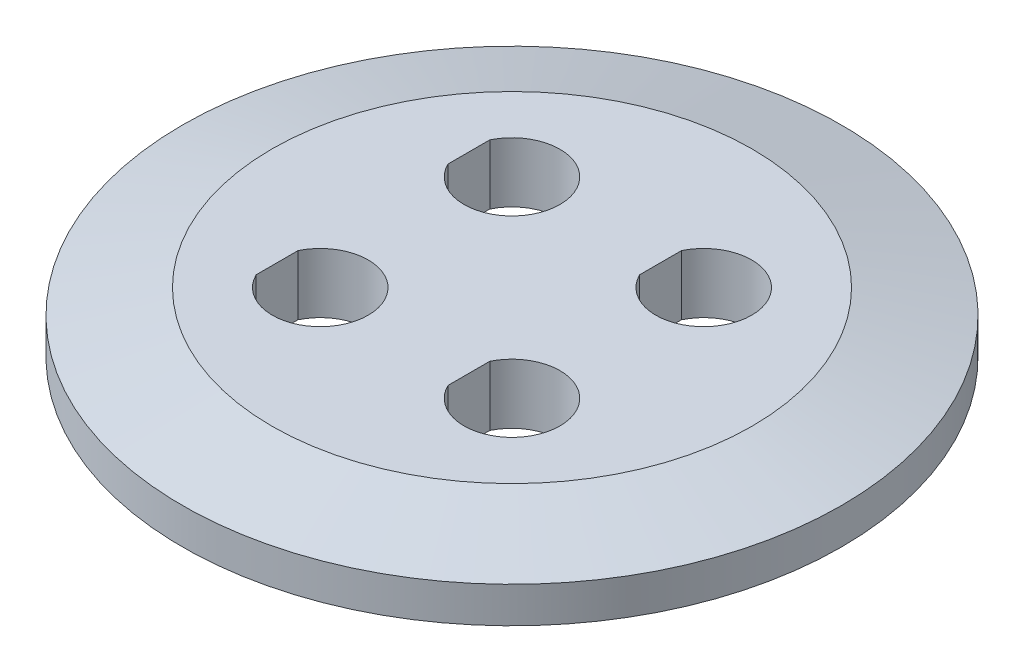
ISO-10303-21;
HEADER;
FILE_DESCRIPTION(('STEP AP214'),'2;1');
FILE_NAME('part.step','',(''),(''),'','','');
FILE_SCHEMA(('AUTOMOTIVE_DESIGN { 1 0 10303 214 1 1 1 1 }'));
ENDSEC;
DATA;
#1=APPLICATION_CONTEXT('core data for automotive mechanical design processes');
#2=APPLICATION_PROTOCOL_DEFINITION('international standard','automotive_design',2000,#1);
#3=PRODUCT_CONTEXT('',#1,'mechanical');
#4=PRODUCT('Part','Part','',(#3));
#5=PRODUCT_RELATED_PRODUCT_CATEGORY('part','',(#4));
#6=PRODUCT_DEFINITION_FORMATION('','',#4);
#7=PRODUCT_DEFINITION_CONTEXT('part definition',#1,'design');
#8=PRODUCT_DEFINITION('design','',#6,#7);
#9=PRODUCT_DEFINITION_SHAPE('','',#8);
#10=(LENGTH_UNIT() NAMED_UNIT(*) SI_UNIT(.MILLI.,.METRE.));
#11=(NAMED_UNIT(*) PLANE_ANGLE_UNIT() SI_UNIT($,.RADIAN.));
#12=(NAMED_UNIT(*) SI_UNIT($,.STERADIAN.) SOLID_ANGLE_UNIT());
#13=UNCERTAINTY_MEASURE_WITH_UNIT(LENGTH_MEASURE(1.E-05),#10,'distance_accuracy_value','');
#14=(GEOMETRIC_REPRESENTATION_CONTEXT(3) GLOBAL_UNCERTAINTY_ASSIGNED_CONTEXT((#13)) GLOBAL_UNIT_ASSIGNED_CONTEXT((#10,
#11,#12)) REPRESENTATION_CONTEXT('',''));
#15=CARTESIAN_POINT('',(0.,0.,0.));
#16=DIRECTION('',(0.,0.,1.));
#17=DIRECTION('',(1.,0.,0.));
#18=AXIS2_PLACEMENT_3D('',#15,#16,#17);
#19=CARTESIAN_POINT('',(-8.,0.,-8.));
#20=DIRECTION('',(0.,1.,0.));
#21=DIRECTION('',(1.,0.,0.));
#22=AXIS2_PLACEMENT_3D('',#19,#20,#21);
#23=CYLINDRICAL_SURFACE('',#22,4.);
#24=CARTESIAN_POINT('',(-8.,0.,-8.));
#25=DIRECTION('',(0.,1.,0.));
#26=DIRECTION('',(-0.899999999999987,0.,0.435889894354094));
#27=AXIS2_PLACEMENT_3D('',#24,#25,#26);
#28=CIRCLE('',#27,4.);
#29=CARTESIAN_POINT('',(-11.6,0.,-6.256440422584));
#30=VERTEX_POINT('',#29);
#31=CARTESIAN_POINT('',(-11.6,0.,-9.743559577416));
#32=VERTEX_POINT('',#31);
#33=EDGE_CURVE('E113',#30,#32,#28,.T.);
#34=ORIENTED_EDGE('',*,*,#33,.T.);
#35=DIRECTION('',(0.,-1.,0.));
#36=VECTOR('',#35,1.);
#37=CARTESIAN_POINT('',(-11.6,0.,-9.743559577416));
#38=LINE('',#37,#36);
#39=CARTESIAN_POINT('',(-11.6,-5.,-9.743559577416));
#40=VERTEX_POINT('',#39);
#41=EDGE_CURVE('E11',#32,#40,#38,.T.);
#42=ORIENTED_EDGE('',*,*,#41,.T.);
#43=CARTESIAN_POINT('',(-8.,-5.,-8.));
#44=DIRECTION('',(0.,1.,0.));
#45=DIRECTION('',(-0.899999999999987,0.,0.435889894354094));
#46=AXIS2_PLACEMENT_3D('',#43,#44,#45);
#47=CIRCLE('',#46,4.);
#48=CARTESIAN_POINT('',(-11.6,-5.,-6.256440422584));
#49=VERTEX_POINT('',#48);
#50=EDGE_CURVE('E116',#49,#40,#47,.T.);
#51=ORIENTED_EDGE('',*,*,#50,.F.);
#52=DIRECTION('',(0.,-1.,0.));
#53=VECTOR('',#52,1.);
#54=CARTESIAN_POINT('',(-11.6,0.,-6.256440422584));
#55=LINE('',#54,#53);
#56=EDGE_CURVE('E28',#30,#49,#55,.T.);
#57=ORIENTED_EDGE('',*,*,#56,.F.);
#58=EDGE_LOOP('',(#34,#42,#51,#57));
#59=FACE_BOUND('',#58,.T.);
#60=ADVANCED_FACE('F17',(#59),#23,.F.);
#61=CARTESIAN_POINT('',(-11.6,0.,-9.743559577416));
#62=DIRECTION('',(-1.,0.,0.));
#63=DIRECTION('',(0.,0.,1.));
#64=AXIS2_PLACEMENT_3D('',#61,#62,#63);
#65=PLANE('',#64);
#66=DIRECTION('',(0.,0.,1.));
#67=VECTOR('',#66,1.);
#68=CARTESIAN_POINT('',(-11.6,0.,-9.743559577416));
#69=LINE('',#68,#67);
#70=EDGE_CURVE('E124',#32,#30,#69,.T.);
#71=ORIENTED_EDGE('',*,*,#70,.T.);
#72=ORIENTED_EDGE('',*,*,#56,.T.);
#73=DIRECTION('',(0.,0.,1.));
#74=VECTOR('',#73,1.);
#75=CARTESIAN_POINT('',(-11.6,-5.,-9.743559577416));
#76=LINE('',#75,#74);
#77=EDGE_CURVE('E140',#40,#49,#76,.T.);
#78=ORIENTED_EDGE('',*,*,#77,.F.);
#79=ORIENTED_EDGE('',*,*,#41,.F.);
#80=EDGE_LOOP('',(#71,#72,#78,#79));
#81=FACE_BOUND('',#80,.T.);
#82=ADVANCED_FACE('F127',(#81),#65,.F.);
#83=CARTESIAN_POINT('',(-8.,0.,8.));
#84=DIRECTION('',(0.,1.,0.));
#85=DIRECTION('',(1.,0.,0.));
#86=AXIS2_PLACEMENT_3D('',#83,#84,#85);
#87=CYLINDRICAL_SURFACE('',#86,4.);
#88=CARTESIAN_POINT('',(-8.,0.,8.));
#89=DIRECTION('',(0.,1.,0.));
#90=DIRECTION('',(-0.899999999999987,0.,0.435889894354094));
#91=AXIS2_PLACEMENT_3D('',#88,#89,#90);
#92=CIRCLE('',#91,4.);
#93=CARTESIAN_POINT('',(-11.6,0.,9.743559577416));
#94=VERTEX_POINT('',#93);
#95=CARTESIAN_POINT('',(-11.6,0.,6.256440422584));
#96=VERTEX_POINT('',#95);
#97=EDGE_CURVE('E129',#94,#96,#92,.T.);
#98=ORIENTED_EDGE('',*,*,#97,.T.);
#99=DIRECTION('',(0.,-1.,0.));
#100=VECTOR('',#99,1.);
#101=CARTESIAN_POINT('',(-11.6,0.,6.256440422584));
#102=LINE('',#101,#100);
#103=CARTESIAN_POINT('',(-11.6,-5.,6.256440422584));
#104=VERTEX_POINT('',#103);
#105=EDGE_CURVE('E119',#96,#104,#102,.T.);
#106=ORIENTED_EDGE('',*,*,#105,.T.);
#107=CARTESIAN_POINT('',(-8.,-5.,8.));
#108=DIRECTION('',(0.,1.,0.));
#109=DIRECTION('',(-0.899999999999987,0.,0.435889894354094));
#110=AXIS2_PLACEMENT_3D('',#107,#108,#109);
#111=CIRCLE('',#110,4.);
#112=CARTESIAN_POINT('',(-11.6,-5.,9.743559577416));
#113=VERTEX_POINT('',#112);
#114=EDGE_CURVE('E367',#113,#104,#111,.T.);
#115=ORIENTED_EDGE('',*,*,#114,.F.);
#116=DIRECTION('',(0.,-1.,0.));
#117=VECTOR('',#116,1.);
#118=CARTESIAN_POINT('',(-11.6,0.,9.743559577416));
#119=LINE('',#118,#117);
#120=EDGE_CURVE('E205',#94,#113,#119,.T.);
#121=ORIENTED_EDGE('',*,*,#120,.F.);
#122=EDGE_LOOP('',(#98,#106,#115,#121));
#123=FACE_BOUND('',#122,.T.);
#124=ADVANCED_FACE('F303',(#123),#87,.F.);
#125=CARTESIAN_POINT('',(-11.6,0.,6.256440422584));
#126=DIRECTION('',(-1.,0.,0.));
#127=DIRECTION('',(0.,0.,1.));
#128=AXIS2_PLACEMENT_3D('',#125,#126,#127);
#129=PLANE('',#128);
#130=DIRECTION('',(0.,0.,1.));
#131=VECTOR('',#130,1.);
#132=CARTESIAN_POINT('',(-11.6,0.,6.256440422584));
#133=LINE('',#132,#131);
#134=EDGE_CURVE('E136',#96,#94,#133,.T.);
#135=ORIENTED_EDGE('',*,*,#134,.T.);
#136=ORIENTED_EDGE('',*,*,#120,.T.);
#137=DIRECTION('',(0.,0.,1.));
#138=VECTOR('',#137,1.);
#139=CARTESIAN_POINT('',(-11.6,-5.,6.256440422584));
#140=LINE('',#139,#138);
#141=EDGE_CURVE('E146',#104,#113,#140,.T.);
#142=ORIENTED_EDGE('',*,*,#141,.F.);
#143=ORIENTED_EDGE('',*,*,#105,.F.);
#144=EDGE_LOOP('',(#135,#136,#142,#143));
#145=FACE_BOUND('',#144,.T.);
#146=ADVANCED_FACE('F308',(#145),#129,.F.);
#147=CARTESIAN_POINT('',(8.,0.,-8.));
#148=DIRECTION('',(0.,1.,0.));
#149=DIRECTION('',(1.,0.,0.));
#150=AXIS2_PLACEMENT_3D('',#147,#148,#149);
#151=CYLINDRICAL_SURFACE('',#150,4.);
#152=CARTESIAN_POINT('',(8.,0.,-8.));
#153=DIRECTION('',(0.,1.,0.));
#154=DIRECTION('',(-0.899999999999987,0.,0.435889894354094));
#155=AXIS2_PLACEMENT_3D('',#152,#153,#154);
#156=CIRCLE('',#155,4.);
#157=CARTESIAN_POINT('',(4.4,0.,-6.256440422584));
#158=VERTEX_POINT('',#157);
#159=CARTESIAN_POINT('',(4.4,0.,-9.743559577416));
#160=VERTEX_POINT('',#159);
#161=EDGE_CURVE('E175',#158,#160,#156,.T.);
#162=ORIENTED_EDGE('',*,*,#161,.T.);
#163=DIRECTION('',(0.,-1.,0.));
#164=VECTOR('',#163,1.);
#165=CARTESIAN_POINT('',(4.4,0.,-9.743559577416));
#166=LINE('',#165,#164);
#167=CARTESIAN_POINT('',(4.4,-5.,-9.743559577416));
#168=VERTEX_POINT('',#167);
#169=EDGE_CURVE('E208',#160,#168,#166,.T.);
#170=ORIENTED_EDGE('',*,*,#169,.T.);
#171=CARTESIAN_POINT('',(8.,-5.,-8.));
#172=DIRECTION('',(0.,1.,0.));
#173=DIRECTION('',(-0.899999999999987,0.,0.435889894354094));
#174=AXIS2_PLACEMENT_3D('',#171,#172,#173);
#175=CIRCLE('',#174,4.);
#176=CARTESIAN_POINT('',(4.4,-5.,-6.256440422584));
#177=VERTEX_POINT('',#176);
#178=EDGE_CURVE('E142',#177,#168,#175,.T.);
#179=ORIENTED_EDGE('',*,*,#178,.F.);
#180=DIRECTION('',(0.,-1.,0.));
#181=VECTOR('',#180,1.);
#182=CARTESIAN_POINT('',(4.4,0.,-6.256440422584));
#183=LINE('',#182,#181);
#184=EDGE_CURVE('E216',#158,#177,#183,.T.);
#185=ORIENTED_EDGE('',*,*,#184,.F.);
#186=EDGE_LOOP('',(#162,#170,#179,#185));
#187=FACE_BOUND('',#186,.T.);
#188=ADVANCED_FACE('F313',(#187),#151,.F.);
#189=CARTESIAN_POINT('',(4.4,0.,-9.743559577416));
#190=DIRECTION('',(-1.,0.,0.));
#191=DIRECTION('',(0.,0.,1.));
#192=AXIS2_PLACEMENT_3D('',#189,#190,#191);
#193=PLANE('',#192);
#194=DIRECTION('',(0.,0.,1.));
#195=VECTOR('',#194,1.);
#196=CARTESIAN_POINT('',(4.4,0.,-9.743559577416));
#197=LINE('',#196,#195);
#198=EDGE_CURVE('E234',#160,#158,#197,.T.);
#199=ORIENTED_EDGE('',*,*,#198,.T.);
#200=ORIENTED_EDGE('',*,*,#184,.T.);
#201=DIRECTION('',(0.,0.,1.));
#202=VECTOR('',#201,1.);
#203=CARTESIAN_POINT('',(4.4,-5.,-9.743559577416));
#204=LINE('',#203,#202);
#205=EDGE_CURVE('E147',#168,#177,#204,.T.);
#206=ORIENTED_EDGE('',*,*,#205,.F.);
#207=ORIENTED_EDGE('',*,*,#169,.F.);
#208=EDGE_LOOP('',(#199,#200,#206,#207));
#209=FACE_BOUND('',#208,.T.);
#210=ADVANCED_FACE('F311',(#209),#193,.F.);
#211=CARTESIAN_POINT('',(8.,0.,8.));
#212=DIRECTION('',(0.,1.,0.));
#213=DIRECTION('',(1.,0.,0.));
#214=AXIS2_PLACEMENT_3D('',#211,#212,#213);
#215=CYLINDRICAL_SURFACE('',#214,4.);
#216=CARTESIAN_POINT('',(8.,0.,8.));
#217=DIRECTION('',(0.,1.,0.));
#218=DIRECTION('',(-0.899999999999987,0.,0.435889894354094));
#219=AXIS2_PLACEMENT_3D('',#216,#217,#218);
#220=CIRCLE('',#219,4.);
#221=CARTESIAN_POINT('',(4.4,0.,9.743559577416));
#222=VERTEX_POINT('',#221);
#223=CARTESIAN_POINT('',(4.4,0.,6.256440422584));
#224=VERTEX_POINT('',#223);
#225=EDGE_CURVE('E166',#222,#224,#220,.T.);
#226=ORIENTED_EDGE('',*,*,#225,.T.);
#227=DIRECTION('',(0.,-1.,0.));
#228=VECTOR('',#227,1.);
#229=CARTESIAN_POINT('',(4.4,0.,6.256440422584));
#230=LINE('',#229,#228);
#231=CARTESIAN_POINT('',(4.4,-5.,6.256440422584));
#232=VERTEX_POINT('',#231);
#233=EDGE_CURVE('E188',#224,#232,#230,.T.);
#234=ORIENTED_EDGE('',*,*,#233,.T.);
#235=CARTESIAN_POINT('',(8.,-5.,8.));
#236=DIRECTION('',(0.,1.,0.));
#237=DIRECTION('',(-0.899999999999987,0.,0.435889894354094));
#238=AXIS2_PLACEMENT_3D('',#235,#236,#237);
#239=CIRCLE('',#238,4.);
#240=CARTESIAN_POINT('',(4.4,-5.,9.743559577416));
#241=VERTEX_POINT('',#240);
#242=EDGE_CURVE('E156',#241,#232,#239,.T.);
#243=ORIENTED_EDGE('',*,*,#242,.F.);
#244=DIRECTION('',(0.,-1.,0.));
#245=VECTOR('',#244,1.);
#246=CARTESIAN_POINT('',(4.4,0.,9.743559577416));
#247=LINE('',#246,#245);
#248=EDGE_CURVE('E186',#222,#241,#247,.T.);
#249=ORIENTED_EDGE('',*,*,#248,.F.);
#250=EDGE_LOOP('',(#226,#234,#243,#249));
#251=FACE_BOUND('',#250,.T.);
#252=ADVANCED_FACE('F262',(#251),#215,.F.);
#253=CARTESIAN_POINT('',(4.4,0.,6.256440422584));
#254=DIRECTION('',(-1.,0.,0.));
#255=DIRECTION('',(0.,0.,1.));
#256=AXIS2_PLACEMENT_3D('',#253,#254,#255);
#257=PLANE('',#256);
#258=DIRECTION('',(0.,0.,1.));
#259=VECTOR('',#258,1.);
#260=CARTESIAN_POINT('',(4.4,0.,6.256440422584));
#261=LINE('',#260,#259);
#262=EDGE_CURVE('E162',#224,#222,#261,.T.);
#263=ORIENTED_EDGE('',*,*,#262,.T.);
#264=ORIENTED_EDGE('',*,*,#248,.T.);
#265=DIRECTION('',(0.,0.,1.));
#266=VECTOR('',#265,1.);
#267=CARTESIAN_POINT('',(4.4,-5.,6.256440422584));
#268=LINE('',#267,#266);
#269=EDGE_CURVE('E171',#232,#241,#268,.T.);
#270=ORIENTED_EDGE('',*,*,#269,.F.);
#271=ORIENTED_EDGE('',*,*,#233,.F.);
#272=EDGE_LOOP('',(#263,#264,#270,#271));
#273=FACE_BOUND('',#272,.T.);
#274=ADVANCED_FACE('F266',(#273),#257,.F.);
#275=CARTESIAN_POINT('',(0.,-5.,0.));
#276=DIRECTION('',(0.,-1.,0.));
#277=DIRECTION('',(0.,0.,-1.));
#278=AXIS2_PLACEMENT_3D('',#275,#276,#277);
#279=PLANE('',#278);
#280=ORIENTED_EDGE('',*,*,#77,.T.);
#281=ORIENTED_EDGE('',*,*,#50,.T.);
#282=EDGE_LOOP('',(#280,#281));
#283=FACE_BOUND('',#282,.T.);
#284=ORIENTED_EDGE('',*,*,#141,.T.);
#285=ORIENTED_EDGE('',*,*,#114,.T.);
#286=EDGE_LOOP('',(#284,#285));
#287=FACE_BOUND('',#286,.T.);
#288=ORIENTED_EDGE('',*,*,#205,.T.);
#289=ORIENTED_EDGE('',*,*,#178,.T.);
#290=EDGE_LOOP('',(#288,#289));
#291=FACE_BOUND('',#290,.T.);
#292=ORIENTED_EDGE('',*,*,#269,.T.);
#293=ORIENTED_EDGE('',*,*,#242,.T.);
#294=EDGE_LOOP('',(#292,#293));
#295=FACE_BOUND('',#294,.T.);
#296=CARTESIAN_POINT('',(0.,-5.,0.));
#297=DIRECTION('',(0.,1.,0.));
#298=DIRECTION('',(-1.,0.,0.));
#299=AXIS2_PLACEMENT_3D('',#296,#297,#298);
#300=CIRCLE('',#299,17.5);
#301=CARTESIAN_POINT('',(17.5,-5.,0.));
#302=VERTEX_POINT('',#301);
#303=EDGE_CURVE('E185',#302,#302,#300,.T.);
#304=ORIENTED_EDGE('',*,*,#303,.F.);
#305=EDGE_LOOP('',(#304));
#306=FACE_BOUND('',#305,.T.);
#307=ADVANCED_FACE('F285',(#283,#287,#291,#295,#306),#279,.T.);
#308=CARTESIAN_POINT('',(0.,0.25,0.));
#309=DIRECTION('',(0.,-1.,0.));
#310=DIRECTION('',(-1.,0.,0.));
#311=AXIS2_PLACEMENT_3D('',#308,#309,#310);
#312=CYLINDRICAL_SURFACE('',#311,17.5);
#313=ORIENTED_EDGE('',*,*,#303,.T.);
#314=DIRECTION('',(0.,1.,0.));
#315=VECTOR('',#314,1.);
#316=CARTESIAN_POINT('',(17.5,0.25,0.));
#317=LINE('',#316,#315);
#318=CARTESIAN_POINT('',(17.5,-2.5,0.));
#319=VERTEX_POINT('',#318);
#320=EDGE_CURVE('E182',#302,#319,#317,.T.);
#321=ORIENTED_EDGE('',*,*,#320,.T.);
#322=CARTESIAN_POINT('',(0.,-2.5,0.));
#323=DIRECTION('',(0.,-1.,0.));
#324=DIRECTION('',(-1.,0.,0.));
#325=AXIS2_PLACEMENT_3D('',#322,#323,#324);
#326=CIRCLE('',#325,17.5);
#327=EDGE_CURVE('E178',#319,#319,#326,.T.);
#328=ORIENTED_EDGE('',*,*,#327,.T.);
#329=ORIENTED_EDGE('',*,*,#320,.F.);
#330=EDGE_LOOP('',(#313,#321,#328,#329));
#331=FACE_BOUND('',#330,.T.);
#332=ADVANCED_FACE('F282',(#331),#312,.T.);
#333=CARTESIAN_POINT('',(0.,-2.5,0.));
#334=DIRECTION('',(0.,-1.,0.));
#335=DIRECTION('',(0.,0.,-1.));
#336=AXIS2_PLACEMENT_3D('',#333,#334,#335);
#337=PLANE('',#336);
#338=ORIENTED_EDGE('',*,*,#327,.F.);
#339=EDGE_LOOP('',(#338));
#340=FACE_BOUND('',#339,.T.);
#341=CARTESIAN_POINT('',(0.,-2.5,0.));
#342=DIRECTION('',(0.,1.,0.));
#343=DIRECTION('',(-1.,0.,0.));
#344=AXIS2_PLACEMENT_3D('',#341,#342,#343);
#345=CIRCLE('',#344,20.6);
#346=CARTESIAN_POINT('',(20.6,-2.5,0.));
#347=VERTEX_POINT('',#346);
#348=EDGE_CURVE('E148',#347,#347,#345,.T.);
#349=ORIENTED_EDGE('',*,*,#348,.F.);
#350=EDGE_LOOP('',(#349));
#351=FACE_BOUND('',#350,.T.);
#352=ADVANCED_FACE('F284',(#340,#351),#337,.T.);
#353=CARTESIAN_POINT('',(0.,0.25,0.));
#354=DIRECTION('',(0.,-1.,0.));
#355=DIRECTION('',(-1.,0.,0.));
#356=AXIS2_PLACEMENT_3D('',#353,#354,#355);
#357=CYLINDRICAL_SURFACE('',#356,20.6);
#358=ORIENTED_EDGE('',*,*,#348,.T.);
#359=DIRECTION('',(0.,-1.,0.));
#360=VECTOR('',#359,1.);
#361=CARTESIAN_POINT('',(20.6,0.25,0.));
#362=LINE('',#361,#360);
#363=CARTESIAN_POINT('',(20.6,-5.,0.));
#364=VERTEX_POINT('',#363);
#365=EDGE_CURVE('E152',#347,#364,#362,.T.);
#366=ORIENTED_EDGE('',*,*,#365,.T.);
#367=CARTESIAN_POINT('',(0.,-5.,0.));
#368=DIRECTION('',(0.,-1.,0.));
#369=DIRECTION('',(-1.,0.,0.));
#370=AXIS2_PLACEMENT_3D('',#367,#368,#369);
#371=CIRCLE('',#370,20.6);
#372=EDGE_CURVE('E153',#364,#364,#371,.T.);
#373=ORIENTED_EDGE('',*,*,#372,.T.);
#374=ORIENTED_EDGE('',*,*,#365,.F.);
#375=EDGE_LOOP('',(#358,#366,#373,#374));
#376=FACE_BOUND('',#375,.T.);
#377=ADVANCED_FACE('F19',(#376),#357,.F.);
#378=CARTESIAN_POINT('',(0.,-5.,0.));
#379=DIRECTION('',(0.,-1.,0.));
#380=DIRECTION('',(0.,0.,-1.));
#381=AXIS2_PLACEMENT_3D('',#378,#379,#380);
#382=PLANE('',#381);
#383=ORIENTED_EDGE('',*,*,#372,.F.);
#384=EDGE_LOOP('',(#383));
#385=FACE_BOUND('',#384,.T.);
#386=CARTESIAN_POINT('',(0.,-5.,0.));
#387=DIRECTION('',(0.,1.,0.));
#388=DIRECTION('',(-1.,0.,0.));
#389=AXIS2_PLACEMENT_3D('',#386,#387,#388);
#390=CIRCLE('',#389,27.5);
#391=CARTESIAN_POINT('',(27.5,-5.,0.));
#392=VERTEX_POINT('',#391);
#393=EDGE_CURVE('E211',#392,#392,#390,.T.);
#394=ORIENTED_EDGE('',*,*,#393,.F.);
#395=EDGE_LOOP('',(#394));
#396=FACE_BOUND('',#395,.T.);
#397=ADVANCED_FACE('F314',(#385,#396),#382,.T.);
#398=CARTESIAN_POINT('',(0.,0.25,0.));
#399=DIRECTION('',(0.,-1.,0.));
#400=DIRECTION('',(-1.,0.,0.));
#401=AXIS2_PLACEMENT_3D('',#398,#399,#400);
#402=CYLINDRICAL_SURFACE('',#401,27.5);
#403=ORIENTED_EDGE('',*,*,#393,.T.);
#404=DIRECTION('',(0.,1.,0.));
#405=VECTOR('',#404,1.);
#406=CARTESIAN_POINT('',(27.5,0.25,0.));
#407=LINE('',#406,#405);
#408=CARTESIAN_POINT('',(27.5,-2.,0.));
#409=VERTEX_POINT('',#408);
#410=EDGE_CURVE('E160',#392,#409,#407,.T.);
#411=ORIENTED_EDGE('',*,*,#410,.T.);
#412=CARTESIAN_POINT('',(0.,-2.,0.));
#413=DIRECTION('',(0.,1.,0.));
#414=DIRECTION('',(-1.,0.,0.));
#415=AXIS2_PLACEMENT_3D('',#412,#413,#414);
#416=CIRCLE('',#415,27.5);
#417=EDGE_CURVE('E21',#409,#409,#416,.T.);
#418=ORIENTED_EDGE('',*,*,#417,.F.);
#419=ORIENTED_EDGE('',*,*,#410,.F.);
#420=EDGE_LOOP('',(#403,#411,#418,#419));
#421=FACE_BOUND('',#420,.T.);
#422=ADVANCED_FACE('F316',(#421),#402,.T.);
#423=CARTESIAN_POINT('',(0.,-1.,0.));
#424=DIRECTION('',(0.,-1.,0.));
#425=DIRECTION('',(-1.,0.,0.));
#426=AXIS2_PLACEMENT_3D('',#423,#424,#425);
#427=CONICAL_SURFACE('',#426,23.76794919243,1.30899693899575);
#428=ORIENTED_EDGE('',*,*,#417,.T.);
#429=DIRECTION('',(-0.965925826289068,0.258819045102521,0.));
#430=VECTOR('',#429,1.);
#431=CARTESIAN_POINT('',(23.76794919243,-1.,0.));
#432=LINE('',#431,#430);
#433=CARTESIAN_POINT('',(20.03589838486,0.,0.));
#434=VERTEX_POINT('',#433);
#435=EDGE_CURVE('E240',#409,#434,#432,.T.);
#436=ORIENTED_EDGE('',*,*,#435,.T.);
#437=CARTESIAN_POINT('',(0.,0.,0.));
#438=DIRECTION('',(0.,1.,0.));
#439=DIRECTION('',(-1.,0.,0.));
#440=AXIS2_PLACEMENT_3D('',#437,#438,#439);
#441=CIRCLE('',#440,20.03589838486);
#442=EDGE_CURVE('E167',#434,#434,#441,.T.);
#443=ORIENTED_EDGE('',*,*,#442,.F.);
#444=ORIENTED_EDGE('',*,*,#435,.F.);
#445=EDGE_LOOP('',(#428,#436,#443,#444));
#446=FACE_BOUND('',#445,.T.);
#447=ADVANCED_FACE('F322',(#446),#427,.T.);
#448=CARTESIAN_POINT('',(0.,0.,0.));
#449=DIRECTION('',(0.,-1.,0.));
#450=DIRECTION('',(0.,0.,-1.));
#451=AXIS2_PLACEMENT_3D('',#448,#449,#450);
#452=PLANE('',#451);
#453=ORIENTED_EDGE('',*,*,#70,.F.);
#454=ORIENTED_EDGE('',*,*,#33,.F.);
#455=EDGE_LOOP('',(#453,#454));
#456=FACE_BOUND('',#455,.T.);
#457=ORIENTED_EDGE('',*,*,#134,.F.);
#458=ORIENTED_EDGE('',*,*,#97,.F.);
#459=EDGE_LOOP('',(#457,#458));
#460=FACE_BOUND('',#459,.T.);
#461=ORIENTED_EDGE('',*,*,#198,.F.);
#462=ORIENTED_EDGE('',*,*,#161,.F.);
#463=EDGE_LOOP('',(#461,#462));
#464=FACE_BOUND('',#463,.T.);
#465=ORIENTED_EDGE('',*,*,#262,.F.);
#466=ORIENTED_EDGE('',*,*,#225,.F.);
#467=EDGE_LOOP('',(#465,#466));
#468=FACE_BOUND('',#467,.T.);
#469=ORIENTED_EDGE('',*,*,#442,.T.);
#470=EDGE_LOOP('',(#469));
#471=FACE_BOUND('',#470,.T.);
#472=ADVANCED_FACE('F122',(#456,#460,#464,#468,#471),#452,.F.);
#473=CLOSED_SHELL('',(#60,#82,#124,#146,#188,#210,#252,#274,#307,#332,#352,#377,#397,#422,#447,#472));
#474=MANIFOLD_SOLID_BREP('B1',#473);
#475=ADVANCED_BREP_SHAPE_REPRESENTATION('',(#18,#474),#14);
#476=SHAPE_DEFINITION_REPRESENTATION(#9,#475);
ENDSEC;
END-ISO-10303-21;
